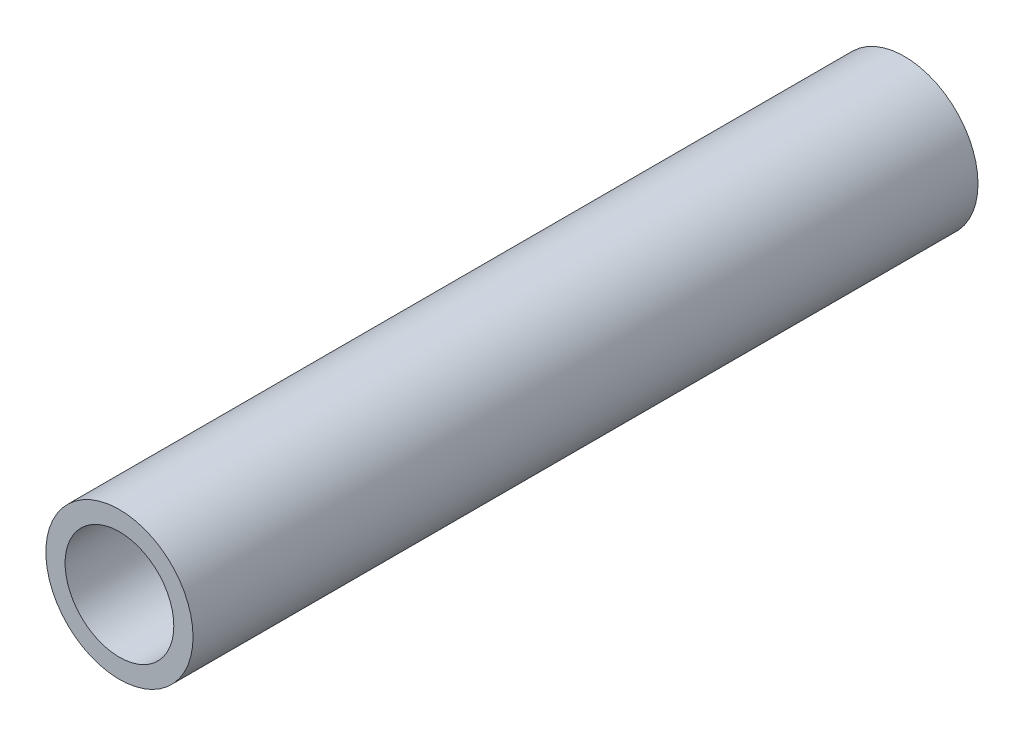
ISO-10303-21;
HEADER;
FILE_DESCRIPTION(('STEP AP214'),'2;1');
FILE_NAME('part.step','',(''),(''),'','','');
FILE_SCHEMA(('AUTOMOTIVE_DESIGN { 1 0 10303 214 1 1 1 1 }'));
ENDSEC;
DATA;
#1=APPLICATION_CONTEXT('core data for automotive mechanical design processes');
#2=APPLICATION_PROTOCOL_DEFINITION('international standard','automotive_design',2000,#1);
#3=PRODUCT_CONTEXT('',#1,'mechanical');
#4=PRODUCT('Part','Part','',(#3));
#5=PRODUCT_RELATED_PRODUCT_CATEGORY('part','',(#4));
#6=PRODUCT_DEFINITION_FORMATION('','',#4);
#7=PRODUCT_DEFINITION_CONTEXT('part definition',#1,'design');
#8=PRODUCT_DEFINITION('design','',#6,#7);
#9=PRODUCT_DEFINITION_SHAPE('','',#8);
#10=(LENGTH_UNIT() NAMED_UNIT(*) SI_UNIT(.MILLI.,.METRE.));
#11=(NAMED_UNIT(*) PLANE_ANGLE_UNIT() SI_UNIT($,.RADIAN.));
#12=(NAMED_UNIT(*) SI_UNIT($,.STERADIAN.) SOLID_ANGLE_UNIT());
#13=UNCERTAINTY_MEASURE_WITH_UNIT(LENGTH_MEASURE(1.E-05),#10,'distance_accuracy_value','');
#14=(GEOMETRIC_REPRESENTATION_CONTEXT(3) GLOBAL_UNCERTAINTY_ASSIGNED_CONTEXT((#13)) GLOBAL_UNIT_ASSIGNED_CONTEXT((#10,
#11,#12)) REPRESENTATION_CONTEXT('',''));
#15=CARTESIAN_POINT('',(0.,0.,0.));
#16=DIRECTION('',(0.,0.,1.));
#17=DIRECTION('',(1.,0.,0.));
#18=AXIS2_PLACEMENT_3D('',#15,#16,#17);
#19=CARTESIAN_POINT('',(0.,0.,50.8));
#20=DIRECTION('',(0.,0.,1.));
#21=DIRECTION('',(1.,0.,0.));
#22=AXIS2_PLACEMENT_3D('',#19,#20,#21);
#23=PLANE('',#22);
#24=CARTESIAN_POINT('',(0.,0.,50.8));
#25=DIRECTION('',(0.,0.,1.));
#26=DIRECTION('',(1.,0.,0.));
#27=AXIS2_PLACEMENT_3D('',#24,#25,#26);
#28=CIRCLE('',#27,4.7625);
#29=CARTESIAN_POINT('',(4.7625,0.,50.8));
#30=VERTEX_POINT('',#29);
#31=EDGE_CURVE('E10',#30,#30,#28,.T.);
#32=ORIENTED_EDGE('',*,*,#31,.T.);
#33=EDGE_LOOP('',(#32));
#34=FACE_BOUND('',#33,.T.);
#35=CARTESIAN_POINT('',(0.,0.,50.8));
#36=DIRECTION('',(0.,0.,1.));
#37=DIRECTION('',(1.,0.,0.));
#38=AXIS2_PLACEMENT_3D('',#35,#36,#37);
#39=CIRCLE('',#38,3.5179);
#40=CARTESIAN_POINT('',(3.5179,0.,50.8));
#41=VERTEX_POINT('',#40);
#42=EDGE_CURVE('E48',#41,#41,#39,.T.);
#43=ORIENTED_EDGE('',*,*,#42,.F.);
#44=EDGE_LOOP('',(#43));
#45=FACE_BOUND('',#44,.T.);
#46=ADVANCED_FACE('F37',(#34,#45),#23,.T.);
#47=CARTESIAN_POINT('',(0.,0.,0.));
#48=DIRECTION('',(0.,0.,1.));
#49=DIRECTION('',(1.,0.,0.));
#50=AXIS2_PLACEMENT_3D('',#47,#48,#49);
#51=PLANE('',#50);
#52=CARTESIAN_POINT('',(0.,0.,0.));
#53=DIRECTION('',(0.,0.,1.));
#54=DIRECTION('',(1.,0.,0.));
#55=AXIS2_PLACEMENT_3D('',#52,#53,#54);
#56=CIRCLE('',#55,4.7625);
#57=CARTESIAN_POINT('',(4.7625,0.,0.));
#58=VERTEX_POINT('',#57);
#59=EDGE_CURVE('E41',#58,#58,#56,.T.);
#60=ORIENTED_EDGE('',*,*,#59,.F.);
#61=EDGE_LOOP('',(#60));
#62=FACE_BOUND('',#61,.T.);
#63=CARTESIAN_POINT('',(0.,0.,0.));
#64=DIRECTION('',(0.,0.,1.));
#65=DIRECTION('',(1.,0.,0.));
#66=AXIS2_PLACEMENT_3D('',#63,#64,#65);
#67=CIRCLE('',#66,3.5179);
#68=CARTESIAN_POINT('',(3.5179,0.,0.));
#69=VERTEX_POINT('',#68);
#70=EDGE_CURVE('E50',#69,#69,#67,.T.);
#71=ORIENTED_EDGE('',*,*,#70,.T.);
#72=EDGE_LOOP('',(#71));
#73=FACE_BOUND('',#72,.T.);
#74=ADVANCED_FACE('F60',(#62,#73),#51,.F.);
#75=CARTESIAN_POINT('',(0.,0.,50.8));
#76=DIRECTION('',(0.,0.,-1.));
#77=DIRECTION('',(-1.,0.,0.));
#78=AXIS2_PLACEMENT_3D('',#75,#76,#77);
#79=CYLINDRICAL_SURFACE('',#78,4.7625);
#80=ORIENTED_EDGE('',*,*,#31,.F.);
#81=EDGE_LOOP('',(#80));
#82=FACE_BOUND('',#81,.T.);
#83=ORIENTED_EDGE('',*,*,#59,.T.);
#84=EDGE_LOOP('',(#83));
#85=FACE_BOUND('',#84,.T.);
#86=ADVANCED_FACE('F39',(#82,#85),#79,.T.);
#87=CARTESIAN_POINT('',(0.,0.,50.8));
#88=DIRECTION('',(0.,0.,-1.));
#89=DIRECTION('',(-1.,0.,0.));
#90=AXIS2_PLACEMENT_3D('',#87,#88,#89);
#91=CYLINDRICAL_SURFACE('',#90,3.5179);
#92=ORIENTED_EDGE('',*,*,#42,.T.);
#93=EDGE_LOOP('',(#92));
#94=FACE_BOUND('',#93,.T.);
#95=ORIENTED_EDGE('',*,*,#70,.F.);
#96=EDGE_LOOP('',(#95));
#97=FACE_BOUND('',#96,.T.);
#98=ADVANCED_FACE('F56',(#94,#97),#91,.F.);
#99=CLOSED_SHELL('',(#46,#74,#86,#98));
#100=MANIFOLD_SOLID_BREP('B2',#99);
#101=ADVANCED_BREP_SHAPE_REPRESENTATION('',(#18,#100),#14);
#102=SHAPE_DEFINITION_REPRESENTATION(#9,#101);
ENDSEC;
END-ISO-10303-21;
